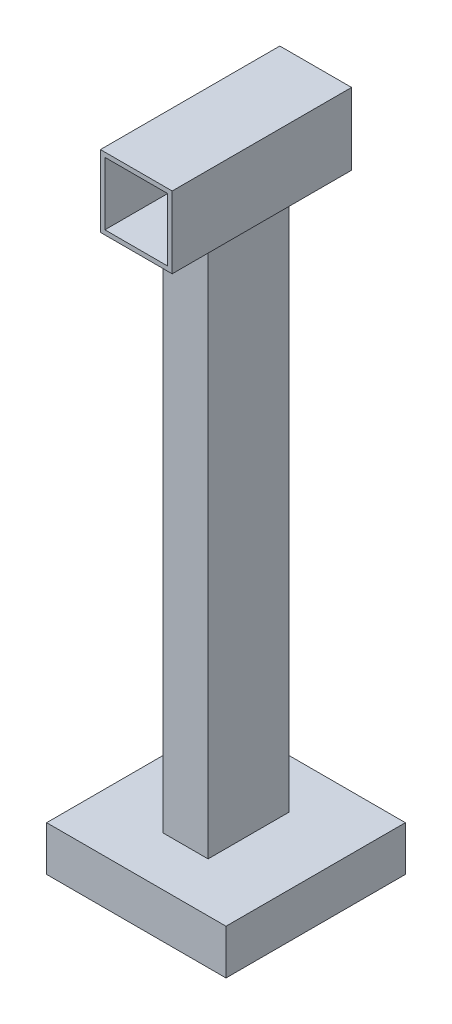
ISO-10303-21;
HEADER;
FILE_DESCRIPTION(('STEP AP214'),'2;1');
FILE_NAME('part.step','',(''),(''),'','','');
FILE_SCHEMA(('AUTOMOTIVE_DESIGN { 1 0 10303 214 1 1 1 1 }'));
ENDSEC;
DATA;
#1=APPLICATION_CONTEXT('core data for automotive mechanical design processes');
#2=APPLICATION_PROTOCOL_DEFINITION('international standard','automotive_design',2000,#1);
#3=PRODUCT_CONTEXT('',#1,'mechanical');
#4=PRODUCT('Part','Part','',(#3));
#5=PRODUCT_RELATED_PRODUCT_CATEGORY('part','',(#4));
#6=PRODUCT_DEFINITION_FORMATION('','',#4);
#7=PRODUCT_DEFINITION_CONTEXT('part definition',#1,'design');
#8=PRODUCT_DEFINITION('design','',#6,#7);
#9=PRODUCT_DEFINITION_SHAPE('','',#8);
#10=(LENGTH_UNIT() NAMED_UNIT(*) SI_UNIT(.MILLI.,.METRE.));
#11=(NAMED_UNIT(*) PLANE_ANGLE_UNIT() SI_UNIT($,.RADIAN.));
#12=(NAMED_UNIT(*) SI_UNIT($,.STERADIAN.) SOLID_ANGLE_UNIT());
#13=UNCERTAINTY_MEASURE_WITH_UNIT(LENGTH_MEASURE(1.E-05),#10,'distance_accuracy_value','');
#14=(GEOMETRIC_REPRESENTATION_CONTEXT(3) GLOBAL_UNCERTAINTY_ASSIGNED_CONTEXT((#13)) GLOBAL_UNIT_ASSIGNED_CONTEXT((#10,
#11,#12)) REPRESENTATION_CONTEXT('',''));
#15=CARTESIAN_POINT('',(0.,0.,0.));
#16=DIRECTION('',(0.,0.,1.));
#17=DIRECTION('',(1.,0.,0.));
#18=AXIS2_PLACEMENT_3D('',#15,#16,#17);
#19=CARTESIAN_POINT('',(-20.,-20.,100.));
#20=DIRECTION('',(0.,1.,0.));
#21=DIRECTION('',(0.,0.,1.));
#22=AXIS2_PLACEMENT_3D('',#19,#20,#21);
#23=PLANE('',#22);
#24=DIRECTION('',(1.,0.,0.));
#25=VECTOR('',#24,1.);
#26=CARTESIAN_POINT('',(-20.,-20.,0.));
#27=LINE('',#26,#25);
#28=CARTESIAN_POINT('',(-20.,-20.,0.));
#29=VERTEX_POINT('',#28);
#30=CARTESIAN_POINT('',(20.,-20.,0.));
#31=VERTEX_POINT('',#30);
#32=EDGE_CURVE('E240',#29,#31,#27,.T.);
#33=ORIENTED_EDGE('',*,*,#32,.T.);
#34=DIRECTION('',(0.,0.,-1.));
#35=VECTOR('',#34,1.);
#36=CARTESIAN_POINT('',(20.,-20.,100.));
#37=LINE('',#36,#35);
#38=CARTESIAN_POINT('',(20.,-20.,100.));
#39=VERTEX_POINT('',#38);
#40=EDGE_CURVE('E246',#39,#31,#37,.T.);
#41=ORIENTED_EDGE('',*,*,#40,.F.);
#42=DIRECTION('',(1.,0.,0.));
#43=VECTOR('',#42,1.);
#44=CARTESIAN_POINT('',(-20.,-20.,100.));
#45=LINE('',#44,#43);
#46=CARTESIAN_POINT('',(-20.,-20.,100.));
#47=VERTEX_POINT('',#46);
#48=EDGE_CURVE('E244',#47,#39,#45,.T.);
#49=ORIENTED_EDGE('',*,*,#48,.F.);
#50=DIRECTION('',(0.,0.,-1.));
#51=VECTOR('',#50,1.);
#52=CARTESIAN_POINT('',(-20.,-20.,100.));
#53=LINE('',#52,#51);
#54=EDGE_CURVE('E256',#47,#29,#53,.T.);
#55=ORIENTED_EDGE('',*,*,#54,.T.);
#56=EDGE_LOOP('',(#33,#41,#49,#55));
#57=FACE_BOUND('',#56,.T.);
#58=DIRECTION('',(0.,0.,1.));
#59=VECTOR('',#58,1.);
#60=CARTESIAN_POINT('',(12.5,-20.,72.5));
#61=LINE('',#60,#59);
#62=CARTESIAN_POINT('',(12.5,-20.,27.5));
#63=VERTEX_POINT('',#62);
#64=CARTESIAN_POINT('',(12.5,-20.,72.5));
#65=VERTEX_POINT('',#64);
#66=EDGE_CURVE('E47',#63,#65,#61,.T.);
#67=ORIENTED_EDGE('',*,*,#66,.F.);
#68=DIRECTION('',(1.,0.,0.));
#69=VECTOR('',#68,1.);
#70=CARTESIAN_POINT('',(-12.5,-20.,27.5));
#71=LINE('',#70,#69);
#72=CARTESIAN_POINT('',(-12.5,-20.,27.5));
#73=VERTEX_POINT('',#72);
#74=EDGE_CURVE('E51',#73,#63,#71,.T.);
#75=ORIENTED_EDGE('',*,*,#74,.F.);
#76=DIRECTION('',(0.,0.,-1.));
#77=VECTOR('',#76,1.);
#78=CARTESIAN_POINT('',(-12.5,-20.,72.5));
#79=LINE('',#78,#77);
#80=CARTESIAN_POINT('',(-12.5,-20.,72.5));
#81=VERTEX_POINT('',#80);
#82=EDGE_CURVE('E190',#81,#73,#79,.T.);
#83=ORIENTED_EDGE('',*,*,#82,.F.);
#84=DIRECTION('',(-1.,0.,0.));
#85=VECTOR('',#84,1.);
#86=CARTESIAN_POINT('',(-12.5,-20.,72.5));
#87=LINE('',#86,#85);
#88=EDGE_CURVE('E169',#65,#81,#87,.T.);
#89=ORIENTED_EDGE('',*,*,#88,.F.);
#90=EDGE_LOOP('',(#67,#75,#83,#89));
#91=FACE_BOUND('',#90,.T.);
#92=ADVANCED_FACE('F32',(#57,#91),#23,.F.);
#93=CARTESIAN_POINT('',(0.,0.,100.));
#94=DIRECTION('',(0.,0.,1.));
#95=DIRECTION('',(1.,0.,0.));
#96=AXIS2_PLACEMENT_3D('',#93,#94,#95);
#97=PLANE('',#96);
#98=DIRECTION('',(0.,1.,0.));
#99=VECTOR('',#98,1.);
#100=CARTESIAN_POINT('',(20.,20.,100.));
#101=LINE('',#100,#99);
#102=CARTESIAN_POINT('',(20.,20.,100.));
#103=VERTEX_POINT('',#102);
#104=EDGE_CURVE('E236',#39,#103,#101,.T.);
#105=ORIENTED_EDGE('',*,*,#104,.T.);
#106=DIRECTION('',(-1.,0.,0.));
#107=VECTOR('',#106,1.);
#108=CARTESIAN_POINT('',(-20.,20.,100.));
#109=LINE('',#108,#107);
#110=CARTESIAN_POINT('',(-20.,20.,100.));
#111=VERTEX_POINT('',#110);
#112=EDGE_CURVE('E239',#103,#111,#109,.T.);
#113=ORIENTED_EDGE('',*,*,#112,.T.);
#114=DIRECTION('',(0.,-1.,0.));
#115=VECTOR('',#114,1.);
#116=CARTESIAN_POINT('',(-20.,20.,100.));
#117=LINE('',#116,#115);
#118=EDGE_CURVE('E242',#111,#47,#117,.T.);
#119=ORIENTED_EDGE('',*,*,#118,.T.);
#120=ORIENTED_EDGE('',*,*,#48,.T.);
#121=EDGE_LOOP('',(#105,#113,#119,#120));
#122=FACE_BOUND('',#121,.T.);
#123=DIRECTION('',(-1.,0.,0.));
#124=VECTOR('',#123,1.);
#125=CARTESIAN_POINT('',(-17.5,17.5,100.));
#126=LINE('',#125,#124);
#127=CARTESIAN_POINT('',(17.5,17.5,100.));
#128=VERTEX_POINT('',#127);
#129=CARTESIAN_POINT('',(-17.5,17.5,100.));
#130=VERTEX_POINT('',#129);
#131=EDGE_CURVE('E207',#128,#130,#126,.T.);
#132=ORIENTED_EDGE('',*,*,#131,.F.);
#133=DIRECTION('',(0.,1.,0.));
#134=VECTOR('',#133,1.);
#135=CARTESIAN_POINT('',(17.5,17.5,100.));
#136=LINE('',#135,#134);
#137=CARTESIAN_POINT('',(17.5,-17.5,100.));
#138=VERTEX_POINT('',#137);
#139=EDGE_CURVE('E205',#138,#128,#136,.T.);
#140=ORIENTED_EDGE('',*,*,#139,.F.);
#141=DIRECTION('',(1.,0.,0.));
#142=VECTOR('',#141,1.);
#143=CARTESIAN_POINT('',(-17.5,-17.5,100.));
#144=LINE('',#143,#142);
#145=CARTESIAN_POINT('',(-17.5,-17.5,100.));
#146=VERTEX_POINT('',#145);
#147=EDGE_CURVE('E213',#146,#138,#144,.T.);
#148=ORIENTED_EDGE('',*,*,#147,.F.);
#149=DIRECTION('',(0.,-1.,0.));
#150=VECTOR('',#149,1.);
#151=CARTESIAN_POINT('',(-17.5,17.5,100.));
#152=LINE('',#151,#150);
#153=EDGE_CURVE('E210',#130,#146,#152,.T.);
#154=ORIENTED_EDGE('',*,*,#153,.F.);
#155=EDGE_LOOP('',(#132,#140,#148,#154));
#156=FACE_BOUND('',#155,.T.);
#157=ADVANCED_FACE('F278',(#122,#156),#97,.T.);
#158=CARTESIAN_POINT('',(0.,0.,0.));
#159=DIRECTION('',(0.,0.,1.));
#160=DIRECTION('',(1.,0.,0.));
#161=AXIS2_PLACEMENT_3D('',#158,#159,#160);
#162=PLANE('',#161);
#163=DIRECTION('',(0.,1.,0.));
#164=VECTOR('',#163,1.);
#165=CARTESIAN_POINT('',(20.,20.,0.));
#166=LINE('',#165,#164);
#167=CARTESIAN_POINT('',(20.,20.,0.));
#168=VERTEX_POINT('',#167);
#169=EDGE_CURVE('E235',#31,#168,#166,.T.);
#170=ORIENTED_EDGE('',*,*,#169,.F.);
#171=ORIENTED_EDGE('',*,*,#32,.F.);
#172=DIRECTION('',(0.,-1.,0.));
#173=VECTOR('',#172,1.);
#174=CARTESIAN_POINT('',(-20.,20.,0.));
#175=LINE('',#174,#173);
#176=CARTESIAN_POINT('',(-20.,20.,0.));
#177=VERTEX_POINT('',#176);
#178=EDGE_CURVE('E251',#177,#29,#175,.T.);
#179=ORIENTED_EDGE('',*,*,#178,.F.);
#180=DIRECTION('',(-1.,0.,0.));
#181=VECTOR('',#180,1.);
#182=CARTESIAN_POINT('',(-20.,20.,0.));
#183=LINE('',#182,#181);
#184=EDGE_CURVE('E249',#168,#177,#183,.T.);
#185=ORIENTED_EDGE('',*,*,#184,.F.);
#186=EDGE_LOOP('',(#170,#171,#179,#185));
#187=FACE_BOUND('',#186,.T.);
#188=DIRECTION('',(0.,1.,0.));
#189=VECTOR('',#188,1.);
#190=CARTESIAN_POINT('',(17.5,17.5,0.));
#191=LINE('',#190,#189);
#192=CARTESIAN_POINT('',(17.5,-17.5,0.));
#193=VERTEX_POINT('',#192);
#194=CARTESIAN_POINT('',(17.5,17.5,0.));
#195=VERTEX_POINT('',#194);
#196=EDGE_CURVE('E204',#193,#195,#191,.T.);
#197=ORIENTED_EDGE('',*,*,#196,.T.);
#198=DIRECTION('',(-1.,0.,0.));
#199=VECTOR('',#198,1.);
#200=CARTESIAN_POINT('',(-17.5,17.5,0.));
#201=LINE('',#200,#199);
#202=CARTESIAN_POINT('',(-17.5,17.5,0.));
#203=VERTEX_POINT('',#202);
#204=EDGE_CURVE('E218',#195,#203,#201,.T.);
#205=ORIENTED_EDGE('',*,*,#204,.T.);
#206=DIRECTION('',(0.,-1.,0.));
#207=VECTOR('',#206,1.);
#208=CARTESIAN_POINT('',(-17.5,17.5,0.));
#209=LINE('',#208,#207);
#210=CARTESIAN_POINT('',(-17.5,-17.5,0.));
#211=VERTEX_POINT('',#210);
#212=EDGE_CURVE('E221',#203,#211,#209,.T.);
#213=ORIENTED_EDGE('',*,*,#212,.T.);
#214=DIRECTION('',(1.,0.,0.));
#215=VECTOR('',#214,1.);
#216=CARTESIAN_POINT('',(-17.5,-17.5,0.));
#217=LINE('',#216,#215);
#218=EDGE_CURVE('E208',#211,#193,#217,.T.);
#219=ORIENTED_EDGE('',*,*,#218,.T.);
#220=EDGE_LOOP('',(#197,#205,#213,#219));
#221=FACE_BOUND('',#220,.T.);
#222=ADVANCED_FACE('F269',(#187,#221),#162,.F.);
#223=CARTESIAN_POINT('',(20.,20.,100.));
#224=DIRECTION('',(-1.,0.,0.));
#225=DIRECTION('',(0.,-1.,0.));
#226=AXIS2_PLACEMENT_3D('',#223,#224,#225);
#227=PLANE('',#226);
#228=ORIENTED_EDGE('',*,*,#169,.T.);
#229=DIRECTION('',(0.,0.,-1.));
#230=VECTOR('',#229,1.);
#231=CARTESIAN_POINT('',(20.,20.,100.));
#232=LINE('',#231,#230);
#233=EDGE_CURVE('E11',#103,#168,#232,.T.);
#234=ORIENTED_EDGE('',*,*,#233,.F.);
#235=ORIENTED_EDGE('',*,*,#104,.F.);
#236=ORIENTED_EDGE('',*,*,#40,.T.);
#237=EDGE_LOOP('',(#228,#234,#235,#236));
#238=FACE_BOUND('',#237,.T.);
#239=ADVANCED_FACE('F34',(#238),#227,.F.);
#240=CARTESIAN_POINT('',(-20.,20.,100.));
#241=DIRECTION('',(0.,-1.,0.));
#242=DIRECTION('',(0.,0.,-1.));
#243=AXIS2_PLACEMENT_3D('',#240,#241,#242);
#244=PLANE('',#243);
#245=ORIENTED_EDGE('',*,*,#184,.T.);
#246=DIRECTION('',(0.,0.,-1.));
#247=VECTOR('',#246,1.);
#248=CARTESIAN_POINT('',(-20.,20.,100.));
#249=LINE('',#248,#247);
#250=EDGE_CURVE('E40',#111,#177,#249,.T.);
#251=ORIENTED_EDGE('',*,*,#250,.F.);
#252=ORIENTED_EDGE('',*,*,#112,.F.);
#253=ORIENTED_EDGE('',*,*,#233,.T.);
#254=EDGE_LOOP('',(#245,#251,#252,#253));
#255=FACE_BOUND('',#254,.T.);
#256=ADVANCED_FACE('F280',(#255),#244,.F.);
#257=CARTESIAN_POINT('',(-20.,20.,100.));
#258=DIRECTION('',(1.,0.,0.));
#259=DIRECTION('',(0.,1.,0.));
#260=AXIS2_PLACEMENT_3D('',#257,#258,#259);
#261=PLANE('',#260);
#262=ORIENTED_EDGE('',*,*,#178,.T.);
#263=ORIENTED_EDGE('',*,*,#54,.F.);
#264=ORIENTED_EDGE('',*,*,#118,.F.);
#265=ORIENTED_EDGE('',*,*,#250,.T.);
#266=EDGE_LOOP('',(#262,#263,#264,#265));
#267=FACE_BOUND('',#266,.T.);
#268=ADVANCED_FACE('F263',(#267),#261,.F.);
#269=CARTESIAN_POINT('',(17.5,17.5,100.));
#270=DIRECTION('',(-1.,0.,0.));
#271=DIRECTION('',(0.,-1.,0.));
#272=AXIS2_PLACEMENT_3D('',#269,#270,#271);
#273=PLANE('',#272);
#274=ORIENTED_EDGE('',*,*,#196,.F.);
#275=DIRECTION('',(0.,0.,-1.));
#276=VECTOR('',#275,1.);
#277=CARTESIAN_POINT('',(17.5,-17.5,100.));
#278=LINE('',#277,#276);
#279=EDGE_CURVE('E215',#138,#193,#278,.T.);
#280=ORIENTED_EDGE('',*,*,#279,.F.);
#281=ORIENTED_EDGE('',*,*,#139,.T.);
#282=DIRECTION('',(0.,0.,-1.));
#283=VECTOR('',#282,1.);
#284=CARTESIAN_POINT('',(17.5,17.5,100.));
#285=LINE('',#284,#283);
#286=EDGE_CURVE('E232',#128,#195,#285,.T.);
#287=ORIENTED_EDGE('',*,*,#286,.T.);
#288=EDGE_LOOP('',(#274,#280,#281,#287));
#289=FACE_BOUND('',#288,.T.);
#290=ADVANCED_FACE('F286',(#289),#273,.T.);
#291=CARTESIAN_POINT('',(-17.5,17.5,100.));
#292=DIRECTION('',(0.,-1.,0.));
#293=DIRECTION('',(0.,0.,-1.));
#294=AXIS2_PLACEMENT_3D('',#291,#292,#293);
#295=PLANE('',#294);
#296=ORIENTED_EDGE('',*,*,#204,.F.);
#297=ORIENTED_EDGE('',*,*,#286,.F.);
#298=ORIENTED_EDGE('',*,*,#131,.T.);
#299=DIRECTION('',(0.,0.,-1.));
#300=VECTOR('',#299,1.);
#301=CARTESIAN_POINT('',(-17.5,17.5,100.));
#302=LINE('',#301,#300);
#303=EDGE_CURVE('E230',#130,#203,#302,.T.);
#304=ORIENTED_EDGE('',*,*,#303,.T.);
#305=EDGE_LOOP('',(#296,#297,#298,#304));
#306=FACE_BOUND('',#305,.T.);
#307=ADVANCED_FACE('F299',(#306),#295,.T.);
#308=CARTESIAN_POINT('',(-17.5,17.5,100.));
#309=DIRECTION('',(1.,0.,0.));
#310=DIRECTION('',(0.,1.,0.));
#311=AXIS2_PLACEMENT_3D('',#308,#309,#310);
#312=PLANE('',#311);
#313=ORIENTED_EDGE('',*,*,#212,.F.);
#314=ORIENTED_EDGE('',*,*,#303,.F.);
#315=ORIENTED_EDGE('',*,*,#153,.T.);
#316=DIRECTION('',(0.,0.,-1.));
#317=VECTOR('',#316,1.);
#318=CARTESIAN_POINT('',(-17.5,-17.5,100.));
#319=LINE('',#318,#317);
#320=EDGE_CURVE('E228',#146,#211,#319,.T.);
#321=ORIENTED_EDGE('',*,*,#320,.T.);
#322=EDGE_LOOP('',(#313,#314,#315,#321));
#323=FACE_BOUND('',#322,.T.);
#324=ADVANCED_FACE('F303',(#323),#312,.T.);
#325=CARTESIAN_POINT('',(-17.5,-17.5,100.));
#326=DIRECTION('',(0.,1.,0.));
#327=DIRECTION('',(0.,0.,1.));
#328=AXIS2_PLACEMENT_3D('',#325,#326,#327);
#329=PLANE('',#328);
#330=ORIENTED_EDGE('',*,*,#218,.F.);
#331=ORIENTED_EDGE('',*,*,#320,.F.);
#332=ORIENTED_EDGE('',*,*,#147,.T.);
#333=ORIENTED_EDGE('',*,*,#279,.T.);
#334=EDGE_LOOP('',(#330,#331,#332,#333));
#335=FACE_BOUND('',#334,.T.);
#336=ADVANCED_FACE('F307',(#335),#329,.T.);
#337=CARTESIAN_POINT('',(12.5,-320.,72.5));
#338=DIRECTION('',(-1.,0.,0.));
#339=DIRECTION('',(0.,0.,1.));
#340=AXIS2_PLACEMENT_3D('',#337,#338,#339);
#341=PLANE('',#340);
#342=ORIENTED_EDGE('',*,*,#66,.T.);
#343=DIRECTION('',(0.,1.,0.));
#344=VECTOR('',#343,1.);
#345=CARTESIAN_POINT('',(12.5,-320.,72.5));
#346=LINE('',#345,#344);
#347=CARTESIAN_POINT('',(12.5,-320.,72.5));
#348=VERTEX_POINT('',#347);
#349=EDGE_CURVE('E201',#348,#65,#346,.T.);
#350=ORIENTED_EDGE('',*,*,#349,.F.);
#351=DIRECTION('',(0.,0.,1.));
#352=VECTOR('',#351,1.);
#353=CARTESIAN_POINT('',(12.5,-320.,72.5));
#354=LINE('',#353,#352);
#355=CARTESIAN_POINT('',(12.5,-320.,27.5));
#356=VERTEX_POINT('',#355);
#357=EDGE_CURVE('E175',#356,#348,#354,.T.);
#358=ORIENTED_EDGE('',*,*,#357,.F.);
#359=DIRECTION('',(0.,1.,0.));
#360=VECTOR('',#359,1.);
#361=CARTESIAN_POINT('',(12.5,-320.,27.5));
#362=LINE('',#361,#360);
#363=EDGE_CURVE('E186',#356,#63,#362,.T.);
#364=ORIENTED_EDGE('',*,*,#363,.T.);
#365=EDGE_LOOP('',(#342,#350,#358,#364));
#366=FACE_BOUND('',#365,.T.);
#367=ADVANCED_FACE('F311',(#366),#341,.F.);
#368=CARTESIAN_POINT('',(-12.5,-320.,72.5));
#369=DIRECTION('',(0.,0.,-1.));
#370=DIRECTION('',(-1.,0.,0.));
#371=AXIS2_PLACEMENT_3D('',#368,#369,#370);
#372=PLANE('',#371);
#373=ORIENTED_EDGE('',*,*,#88,.T.);
#374=DIRECTION('',(0.,1.,0.));
#375=VECTOR('',#374,1.);
#376=CARTESIAN_POINT('',(-12.5,-320.,72.5));
#377=LINE('',#376,#375);
#378=CARTESIAN_POINT('',(-12.5,-320.,72.5));
#379=VERTEX_POINT('',#378);
#380=EDGE_CURVE('E198',#379,#81,#377,.T.);
#381=ORIENTED_EDGE('',*,*,#380,.F.);
#382=DIRECTION('',(-1.,0.,0.));
#383=VECTOR('',#382,1.);
#384=CARTESIAN_POINT('',(-12.5,-320.,72.5));
#385=LINE('',#384,#383);
#386=EDGE_CURVE('E178',#348,#379,#385,.T.);
#387=ORIENTED_EDGE('',*,*,#386,.F.);
#388=ORIENTED_EDGE('',*,*,#349,.T.);
#389=EDGE_LOOP('',(#373,#381,#387,#388));
#390=FACE_BOUND('',#389,.T.);
#391=ADVANCED_FACE('F315',(#390),#372,.F.);
#392=CARTESIAN_POINT('',(-12.5,-320.,72.5));
#393=DIRECTION('',(1.,0.,0.));
#394=DIRECTION('',(0.,0.,-1.));
#395=AXIS2_PLACEMENT_3D('',#392,#393,#394);
#396=PLANE('',#395);
#397=ORIENTED_EDGE('',*,*,#82,.T.);
#398=DIRECTION('',(0.,1.,0.));
#399=VECTOR('',#398,1.);
#400=CARTESIAN_POINT('',(-12.5,-320.,27.5));
#401=LINE('',#400,#399);
#402=CARTESIAN_POINT('',(-12.5,-320.,27.5));
#403=VERTEX_POINT('',#402);
#404=EDGE_CURVE('E195',#403,#73,#401,.T.);
#405=ORIENTED_EDGE('',*,*,#404,.F.);
#406=DIRECTION('',(0.,0.,-1.));
#407=VECTOR('',#406,1.);
#408=CARTESIAN_POINT('',(-12.5,-320.,72.5));
#409=LINE('',#408,#407);
#410=EDGE_CURVE('E181',#379,#403,#409,.T.);
#411=ORIENTED_EDGE('',*,*,#410,.F.);
#412=ORIENTED_EDGE('',*,*,#380,.T.);
#413=EDGE_LOOP('',(#397,#405,#411,#412));
#414=FACE_BOUND('',#413,.T.);
#415=ADVANCED_FACE('F319',(#414),#396,.F.);
#416=CARTESIAN_POINT('',(-12.5,-320.,27.5));
#417=DIRECTION('',(0.,0.,1.));
#418=DIRECTION('',(1.,0.,0.));
#419=AXIS2_PLACEMENT_3D('',#416,#417,#418);
#420=PLANE('',#419);
#421=ORIENTED_EDGE('',*,*,#74,.T.);
#422=ORIENTED_EDGE('',*,*,#363,.F.);
#423=DIRECTION('',(1.,0.,0.));
#424=VECTOR('',#423,1.);
#425=CARTESIAN_POINT('',(-12.5,-320.,27.5));
#426=LINE('',#425,#424);
#427=EDGE_CURVE('E184',#403,#356,#426,.T.);
#428=ORIENTED_EDGE('',*,*,#427,.F.);
#429=ORIENTED_EDGE('',*,*,#404,.T.);
#430=EDGE_LOOP('',(#421,#422,#428,#429));
#431=FACE_BOUND('',#430,.T.);
#432=ADVANCED_FACE('F323',(#431),#420,.F.);
#433=CARTESIAN_POINT('',(0.,-320.,0.));
#434=DIRECTION('',(0.,-1.,0.));
#435=DIRECTION('',(0.,0.,-1.));
#436=AXIS2_PLACEMENT_3D('',#433,#434,#435);
#437=PLANE('',#436);
#438=DIRECTION('',(0.,0.,1.));
#439=VECTOR('',#438,1.);
#440=CARTESIAN_POINT('',(50.,-320.,100.));
#441=LINE('',#440,#439);
#442=CARTESIAN_POINT('',(50.,-320.,0.));
#443=VERTEX_POINT('',#442);
#444=CARTESIAN_POINT('',(50.,-320.,100.));
#445=VERTEX_POINT('',#444);
#446=EDGE_CURVE('E167',#443,#445,#441,.T.);
#447=ORIENTED_EDGE('',*,*,#446,.F.);
#448=DIRECTION('',(1.,0.,0.));
#449=VECTOR('',#448,1.);
#450=CARTESIAN_POINT('',(-50.,-320.,0.));
#451=LINE('',#450,#449);
#452=CARTESIAN_POINT('',(-50.,-320.,0.));
#453=VERTEX_POINT('',#452);
#454=EDGE_CURVE('E163',#453,#443,#451,.T.);
#455=ORIENTED_EDGE('',*,*,#454,.F.);
#456=DIRECTION('',(0.,0.,-1.));
#457=VECTOR('',#456,1.);
#458=CARTESIAN_POINT('',(-50.,-320.,100.));
#459=LINE('',#458,#457);
#460=CARTESIAN_POINT('',(-50.,-320.,100.));
#461=VERTEX_POINT('',#460);
#462=EDGE_CURVE('E470',#461,#453,#459,.T.);
#463=ORIENTED_EDGE('',*,*,#462,.F.);
#464=DIRECTION('',(-1.,0.,0.));
#465=VECTOR('',#464,1.);
#466=CARTESIAN_POINT('',(-50.,-320.,100.));
#467=LINE('',#466,#465);
#468=EDGE_CURVE('E468',#445,#461,#467,.T.);
#469=ORIENTED_EDGE('',*,*,#468,.F.);
#470=EDGE_LOOP('',(#447,#455,#463,#469));
#471=FACE_BOUND('',#470,.T.);
#472=ORIENTED_EDGE('',*,*,#427,.T.);
#473=ORIENTED_EDGE('',*,*,#357,.T.);
#474=ORIENTED_EDGE('',*,*,#386,.T.);
#475=ORIENTED_EDGE('',*,*,#410,.T.);
#476=EDGE_LOOP('',(#472,#473,#474,#475));
#477=FACE_BOUND('',#476,.T.);
#478=ADVANCED_FACE('F327',(#471,#477),#437,.F.);
#479=CARTESIAN_POINT('',(50.,-345.,100.));
#480=DIRECTION('',(-1.,0.,0.));
#481=DIRECTION('',(0.,0.,1.));
#482=AXIS2_PLACEMENT_3D('',#479,#480,#481);
#483=PLANE('',#482);
#484=ORIENTED_EDGE('',*,*,#446,.T.);
#485=DIRECTION('',(0.,1.,0.));
#486=VECTOR('',#485,1.);
#487=CARTESIAN_POINT('',(50.,-345.,100.));
#488=LINE('',#487,#486);
#489=CARTESIAN_POINT('',(50.,-345.,100.));
#490=VERTEX_POINT('',#489);
#491=EDGE_CURVE('E147',#490,#445,#488,.T.);
#492=ORIENTED_EDGE('',*,*,#491,.F.);
#493=DIRECTION('',(0.,0.,1.));
#494=VECTOR('',#493,1.);
#495=CARTESIAN_POINT('',(50.,-345.,100.));
#496=LINE('',#495,#494);
#497=CARTESIAN_POINT('',(50.,-345.,0.));
#498=VERTEX_POINT('',#497);
#499=EDGE_CURVE('E154',#498,#490,#496,.T.);
#500=ORIENTED_EDGE('',*,*,#499,.F.);
#501=DIRECTION('',(0.,1.,0.));
#502=VECTOR('',#501,1.);
#503=CARTESIAN_POINT('',(50.,-345.,0.));
#504=LINE('',#503,#502);
#505=EDGE_CURVE('E477',#498,#443,#504,.T.);
#506=ORIENTED_EDGE('',*,*,#505,.T.);
#507=EDGE_LOOP('',(#484,#492,#500,#506));
#508=FACE_BOUND('',#507,.T.);
#509=ADVANCED_FACE('F165',(#508),#483,.F.);
#510=CARTESIAN_POINT('',(-50.,-345.,100.));
#511=DIRECTION('',(0.,0.,-1.));
#512=DIRECTION('',(-1.,0.,0.));
#513=AXIS2_PLACEMENT_3D('',#510,#511,#512);
#514=PLANE('',#513);
#515=ORIENTED_EDGE('',*,*,#468,.T.);
#516=DIRECTION('',(0.,1.,0.));
#517=VECTOR('',#516,1.);
#518=CARTESIAN_POINT('',(-50.,-345.,100.));
#519=LINE('',#518,#517);
#520=CARTESIAN_POINT('',(-50.,-345.,100.));
#521=VERTEX_POINT('',#520);
#522=EDGE_CURVE('E150',#521,#461,#519,.T.);
#523=ORIENTED_EDGE('',*,*,#522,.F.);
#524=DIRECTION('',(-1.,0.,0.));
#525=VECTOR('',#524,1.);
#526=CARTESIAN_POINT('',(-50.,-345.,100.));
#527=LINE('',#526,#525);
#528=EDGE_CURVE('E143',#490,#521,#527,.T.);
#529=ORIENTED_EDGE('',*,*,#528,.F.);
#530=ORIENTED_EDGE('',*,*,#491,.T.);
#531=EDGE_LOOP('',(#515,#523,#529,#530));
#532=FACE_BOUND('',#531,.T.);
#533=ADVANCED_FACE('F145',(#532),#514,.F.);
#534=CARTESIAN_POINT('',(-50.,-345.,100.));
#535=DIRECTION('',(1.,0.,0.));
#536=DIRECTION('',(0.,0.,-1.));
#537=AXIS2_PLACEMENT_3D('',#534,#535,#536);
#538=PLANE('',#537);
#539=ORIENTED_EDGE('',*,*,#462,.T.);
#540=DIRECTION('',(0.,1.,0.));
#541=VECTOR('',#540,1.);
#542=CARTESIAN_POINT('',(-50.,-345.,0.));
#543=LINE('',#542,#541);
#544=CARTESIAN_POINT('',(-50.,-345.,0.));
#545=VERTEX_POINT('',#544);
#546=EDGE_CURVE('E171',#545,#453,#543,.T.);
#547=ORIENTED_EDGE('',*,*,#546,.F.);
#548=DIRECTION('',(0.,0.,-1.));
#549=VECTOR('',#548,1.);
#550=CARTESIAN_POINT('',(-50.,-345.,100.));
#551=LINE('',#550,#549);
#552=EDGE_CURVE('E153',#521,#545,#551,.T.);
#553=ORIENTED_EDGE('',*,*,#552,.F.);
#554=ORIENTED_EDGE('',*,*,#522,.T.);
#555=EDGE_LOOP('',(#539,#547,#553,#554));
#556=FACE_BOUND('',#555,.T.);
#557=ADVANCED_FACE('F333',(#556),#538,.F.);
#558=CARTESIAN_POINT('',(-50.,-345.,0.));
#559=DIRECTION('',(0.,0.,1.));
#560=DIRECTION('',(1.,0.,0.));
#561=AXIS2_PLACEMENT_3D('',#558,#559,#560);
#562=PLANE('',#561);
#563=ORIENTED_EDGE('',*,*,#454,.T.);
#564=ORIENTED_EDGE('',*,*,#505,.F.);
#565=DIRECTION('',(1.,0.,0.));
#566=VECTOR('',#565,1.);
#567=CARTESIAN_POINT('',(-50.,-345.,0.));
#568=LINE('',#567,#566);
#569=EDGE_CURVE('E159',#545,#498,#568,.T.);
#570=ORIENTED_EDGE('',*,*,#569,.F.);
#571=ORIENTED_EDGE('',*,*,#546,.T.);
#572=EDGE_LOOP('',(#563,#564,#570,#571));
#573=FACE_BOUND('',#572,.T.);
#574=ADVANCED_FACE('F336',(#573),#562,.F.);
#575=CARTESIAN_POINT('',(0.,-345.,0.));
#576=DIRECTION('',(0.,-1.,0.));
#577=DIRECTION('',(0.,0.,-1.));
#578=AXIS2_PLACEMENT_3D('',#575,#576,#577);
#579=PLANE('',#578);
#580=ORIENTED_EDGE('',*,*,#499,.T.);
#581=ORIENTED_EDGE('',*,*,#528,.T.);
#582=ORIENTED_EDGE('',*,*,#552,.T.);
#583=ORIENTED_EDGE('',*,*,#569,.T.);
#584=EDGE_LOOP('',(#580,#581,#582,#583));
#585=FACE_BOUND('',#584,.T.);
#586=ADVANCED_FACE('F157',(#585),#579,.T.);
#587=CLOSED_SHELL('',(#92,#157,#222,#239,#256,#268,#290,#307,#324,#336,#367,#391,#415,#432,#478,
#509,#533,#557,#574,#586));
#588=MANIFOLD_SOLID_BREP('B2',#587);
#589=ADVANCED_BREP_SHAPE_REPRESENTATION('',(#18,#588),#14);
#590=SHAPE_DEFINITION_REPRESENTATION(#9,#589);
ENDSEC;
END-ISO-10303-21;
